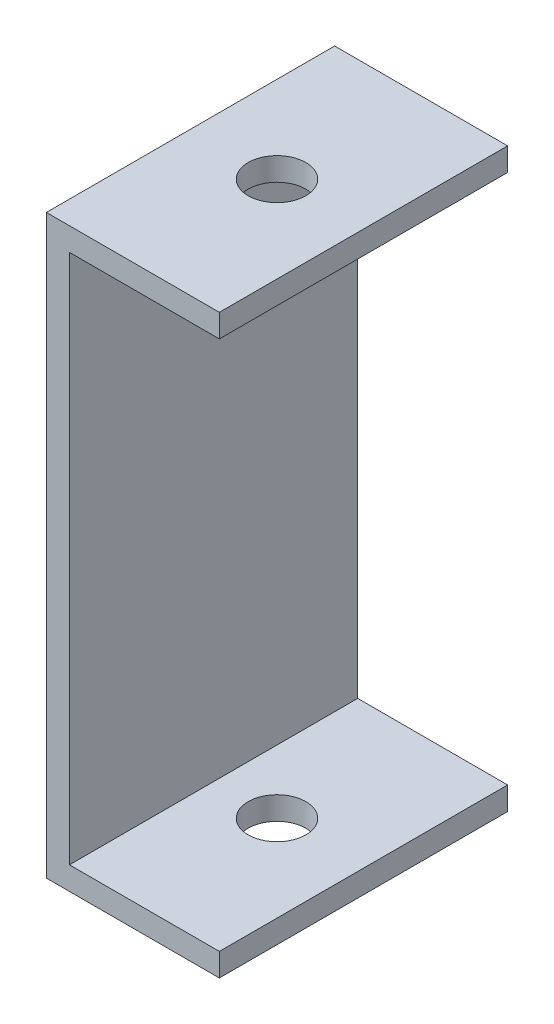
ISO-10303-21;
HEADER;
FILE_DESCRIPTION(('STEP AP214'),'2;1');
FILE_NAME('part.step','',(''),(''),'','','');
FILE_SCHEMA(('AUTOMOTIVE_DESIGN { 1 0 10303 214 1 1 1 1 }'));
ENDSEC;
DATA;
#1=APPLICATION_CONTEXT('core data for automotive mechanical design processes');
#2=APPLICATION_PROTOCOL_DEFINITION('international standard','automotive_design',2000,#1);
#3=PRODUCT_CONTEXT('',#1,'mechanical');
#4=PRODUCT('Part','Part','',(#3));
#5=PRODUCT_RELATED_PRODUCT_CATEGORY('part','',(#4));
#6=PRODUCT_DEFINITION_FORMATION('','',#4);
#7=PRODUCT_DEFINITION_CONTEXT('part definition',#1,'design');
#8=PRODUCT_DEFINITION('design','',#6,#7);
#9=PRODUCT_DEFINITION_SHAPE('','',#8);
#10=(LENGTH_UNIT() NAMED_UNIT(*) SI_UNIT(.MILLI.,.METRE.));
#11=(NAMED_UNIT(*) PLANE_ANGLE_UNIT() SI_UNIT($,.RADIAN.));
#12=(NAMED_UNIT(*) SI_UNIT($,.STERADIAN.) SOLID_ANGLE_UNIT());
#13=UNCERTAINTY_MEASURE_WITH_UNIT(LENGTH_MEASURE(1.E-05),#10,'distance_accuracy_value','');
#14=(GEOMETRIC_REPRESENTATION_CONTEXT(3) GLOBAL_UNCERTAINTY_ASSIGNED_CONTEXT((#13)) GLOBAL_UNIT_ASSIGNED_CONTEXT((#10,
#11,#12)) REPRESENTATION_CONTEXT('',''));
#15=CARTESIAN_POINT('',(0.,0.,0.));
#16=DIRECTION('',(0.,0.,1.));
#17=DIRECTION('',(1.,0.,0.));
#18=AXIS2_PLACEMENT_3D('',#15,#16,#17);
#19=CARTESIAN_POINT('',(15.,2.,25.));
#20=DIRECTION('',(-1.,0.,0.));
#21=DIRECTION('',(0.,0.,1.));
#22=AXIS2_PLACEMENT_3D('',#19,#20,#21);
#23=PLANE('',#22);
#24=DIRECTION('',(0.,1.,0.));
#25=VECTOR('',#24,1.);
#26=CARTESIAN_POINT('',(15.,2.,0.));
#27=LINE('',#26,#25);
#28=CARTESIAN_POINT('',(15.,0.,0.));
#29=VERTEX_POINT('',#28);
#30=CARTESIAN_POINT('',(15.,2.,0.));
#31=VERTEX_POINT('',#30);
#32=EDGE_CURVE('E144',#29,#31,#27,.T.);
#33=ORIENTED_EDGE('',*,*,#32,.T.);
#34=DIRECTION('',(0.,0.,-1.));
#35=VECTOR('',#34,1.);
#36=CARTESIAN_POINT('',(15.,2.,25.));
#37=LINE('',#36,#35);
#38=CARTESIAN_POINT('',(15.,2.,25.));
#39=VERTEX_POINT('',#38);
#40=EDGE_CURVE('E11',#39,#31,#37,.T.);
#41=ORIENTED_EDGE('',*,*,#40,.F.);
#42=DIRECTION('',(0.,1.,0.));
#43=VECTOR('',#42,1.);
#44=CARTESIAN_POINT('',(15.,2.,25.));
#45=LINE('',#44,#43);
#46=CARTESIAN_POINT('',(15.,0.,25.));
#47=VERTEX_POINT('',#46);
#48=EDGE_CURVE('E167',#47,#39,#45,.T.);
#49=ORIENTED_EDGE('',*,*,#48,.F.);
#50=DIRECTION('',(0.,0.,-1.));
#51=VECTOR('',#50,1.);
#52=CARTESIAN_POINT('',(15.,0.,25.));
#53=LINE('',#52,#51);
#54=EDGE_CURVE('E140',#47,#29,#53,.T.);
#55=ORIENTED_EDGE('',*,*,#54,.T.);
#56=EDGE_LOOP('',(#33,#41,#49,#55));
#57=FACE_BOUND('',#56,.T.);
#58=ADVANCED_FACE('F43',(#57),#23,.F.);
#59=CARTESIAN_POINT('',(2.00000000000001,2.,25.));
#60=DIRECTION('',(0.,-1.,0.));
#61=DIRECTION('',(1.,0.,0.));
#62=AXIS2_PLACEMENT_3D('',#59,#60,#61);
#63=PLANE('',#62);
#64=CARTESIAN_POINT('',(7.5,2.,12.5));
#65=DIRECTION('',(0.,-1.,0.));
#66=DIRECTION('',(1.,0.,0.));
#67=AXIS2_PLACEMENT_3D('',#64,#65,#66);
#68=CIRCLE('',#67,2.5);
#69=CARTESIAN_POINT('',(7.5,2.,15.));
#70=VERTEX_POINT('',#69);
#71=EDGE_CURVE('E149',#70,#70,#68,.T.);
#72=ORIENTED_EDGE('',*,*,#71,.T.);
#73=EDGE_LOOP('',(#72));
#74=FACE_BOUND('',#73,.T.);
#75=DIRECTION('',(-1.,0.,0.));
#76=VECTOR('',#75,1.);
#77=CARTESIAN_POINT('',(2.00000000000001,2.,0.));
#78=LINE('',#77,#76);
#79=CARTESIAN_POINT('',(2.00000000000001,2.,0.));
#80=VERTEX_POINT('',#79);
#81=EDGE_CURVE('E148',#31,#80,#78,.T.);
#82=ORIENTED_EDGE('',*,*,#81,.T.);
#83=DIRECTION('',(0.,0.,-1.));
#84=VECTOR('',#83,1.);
#85=CARTESIAN_POINT('',(2.00000000000001,2.,25.));
#86=LINE('',#85,#84);
#87=CARTESIAN_POINT('',(2.00000000000001,2.,25.));
#88=VERTEX_POINT('',#87);
#89=EDGE_CURVE('E52',#88,#80,#86,.T.);
#90=ORIENTED_EDGE('',*,*,#89,.F.);
#91=DIRECTION('',(-1.,0.,0.));
#92=VECTOR('',#91,1.);
#93=CARTESIAN_POINT('',(2.00000000000001,2.,25.));
#94=LINE('',#93,#92);
#95=EDGE_CURVE('E103',#39,#88,#94,.T.);
#96=ORIENTED_EDGE('',*,*,#95,.F.);
#97=ORIENTED_EDGE('',*,*,#40,.T.);
#98=EDGE_LOOP('',(#82,#90,#96,#97));
#99=FACE_BOUND('',#98,.T.);
#100=ADVANCED_FACE('F236',(#74,#99),#63,.F.);
#101=CARTESIAN_POINT('',(2.,48.,25.));
#102=DIRECTION('',(-1.,0.,0.));
#103=DIRECTION('',(0.,-1.,0.));
#104=AXIS2_PLACEMENT_3D('',#101,#102,#103);
#105=PLANE('',#104);
#106=DIRECTION('',(0.,1.,0.));
#107=VECTOR('',#106,1.);
#108=CARTESIAN_POINT('',(2.,48.,0.));
#109=LINE('',#108,#107);
#110=CARTESIAN_POINT('',(2.,48.,0.));
#111=VERTEX_POINT('',#110);
#112=EDGE_CURVE('E152',#80,#111,#109,.T.);
#113=ORIENTED_EDGE('',*,*,#112,.T.);
#114=DIRECTION('',(0.,0.,-1.));
#115=VECTOR('',#114,1.);
#116=CARTESIAN_POINT('',(2.,48.,25.));
#117=LINE('',#116,#115);
#118=CARTESIAN_POINT('',(2.,48.,25.));
#119=VERTEX_POINT('',#118);
#120=EDGE_CURVE('E178',#119,#111,#117,.T.);
#121=ORIENTED_EDGE('',*,*,#120,.F.);
#122=DIRECTION('',(0.,1.,0.));
#123=VECTOR('',#122,1.);
#124=CARTESIAN_POINT('',(2.,48.,25.));
#125=LINE('',#124,#123);
#126=EDGE_CURVE('E188',#88,#119,#125,.T.);
#127=ORIENTED_EDGE('',*,*,#126,.F.);
#128=ORIENTED_EDGE('',*,*,#89,.T.);
#129=EDGE_LOOP('',(#113,#121,#127,#128));
#130=FACE_BOUND('',#129,.T.);
#131=ADVANCED_FACE('F186',(#130),#105,.F.);
#132=CARTESIAN_POINT('',(15.,48.,25.));
#133=DIRECTION('',(0.,1.,0.));
#134=DIRECTION('',(0.,0.,1.));
#135=AXIS2_PLACEMENT_3D('',#132,#133,#134);
#136=PLANE('',#135);
#137=CARTESIAN_POINT('',(7.5,48.,12.5));
#138=DIRECTION('',(0.,1.,0.));
#139=DIRECTION('',(0.,0.,1.));
#140=AXIS2_PLACEMENT_3D('',#137,#138,#139);
#141=CIRCLE('',#140,2.5);
#142=CARTESIAN_POINT('',(7.5,48.,15.));
#143=VERTEX_POINT('',#142);
#144=EDGE_CURVE('E214',#143,#143,#141,.T.);
#145=ORIENTED_EDGE('',*,*,#144,.T.);
#146=EDGE_LOOP('',(#145));
#147=FACE_BOUND('',#146,.T.);
#148=DIRECTION('',(1.,0.,0.));
#149=VECTOR('',#148,1.);
#150=CARTESIAN_POINT('',(15.,48.,0.));
#151=LINE('',#150,#149);
#152=CARTESIAN_POINT('',(15.,48.,0.));
#153=VERTEX_POINT('',#152);
#154=EDGE_CURVE('E155',#111,#153,#151,.T.);
#155=ORIENTED_EDGE('',*,*,#154,.T.);
#156=DIRECTION('',(0.,0.,-1.));
#157=VECTOR('',#156,1.);
#158=CARTESIAN_POINT('',(15.,48.,25.));
#159=LINE('',#158,#157);
#160=CARTESIAN_POINT('',(15.,48.,25.));
#161=VERTEX_POINT('',#160);
#162=EDGE_CURVE('E174',#161,#153,#159,.T.);
#163=ORIENTED_EDGE('',*,*,#162,.F.);
#164=DIRECTION('',(1.,0.,0.));
#165=VECTOR('',#164,1.);
#166=CARTESIAN_POINT('',(15.,48.,25.));
#167=LINE('',#166,#165);
#168=EDGE_CURVE('E201',#119,#161,#167,.T.);
#169=ORIENTED_EDGE('',*,*,#168,.F.);
#170=ORIENTED_EDGE('',*,*,#120,.T.);
#171=EDGE_LOOP('',(#155,#163,#169,#170));
#172=FACE_BOUND('',#171,.T.);
#173=ADVANCED_FACE('F196',(#147,#172),#136,.F.);
#174=CARTESIAN_POINT('',(15.,50.,25.));
#175=DIRECTION('',(-1.,0.,0.));
#176=DIRECTION('',(0.,0.,1.));
#177=AXIS2_PLACEMENT_3D('',#174,#175,#176);
#178=PLANE('',#177);
#179=DIRECTION('',(0.,1.,0.));
#180=VECTOR('',#179,1.);
#181=CARTESIAN_POINT('',(15.,50.,0.));
#182=LINE('',#181,#180);
#183=CARTESIAN_POINT('',(15.,50.,0.));
#184=VERTEX_POINT('',#183);
#185=EDGE_CURVE('E158',#153,#184,#182,.T.);
#186=ORIENTED_EDGE('',*,*,#185,.T.);
#187=DIRECTION('',(0.,0.,-1.));
#188=VECTOR('',#187,1.);
#189=CARTESIAN_POINT('',(15.,50.,25.));
#190=LINE('',#189,#188);
#191=CARTESIAN_POINT('',(15.,50.,25.));
#192=VERTEX_POINT('',#191);
#193=EDGE_CURVE('E133',#192,#184,#190,.T.);
#194=ORIENTED_EDGE('',*,*,#193,.F.);
#195=DIRECTION('',(0.,1.,0.));
#196=VECTOR('',#195,1.);
#197=CARTESIAN_POINT('',(15.,50.,25.));
#198=LINE('',#197,#196);
#199=EDGE_CURVE('E122',#161,#192,#198,.T.);
#200=ORIENTED_EDGE('',*,*,#199,.F.);
#201=ORIENTED_EDGE('',*,*,#162,.T.);
#202=EDGE_LOOP('',(#186,#194,#200,#201));
#203=FACE_BOUND('',#202,.T.);
#204=ADVANCED_FACE('F199',(#203),#178,.F.);
#205=CARTESIAN_POINT('',(0.,50.,25.));
#206=DIRECTION('',(0.,-1.,0.));
#207=DIRECTION('',(0.,0.,-1.));
#208=AXIS2_PLACEMENT_3D('',#205,#206,#207);
#209=PLANE('',#208);
#210=CARTESIAN_POINT('',(7.5,50.,12.5));
#211=DIRECTION('',(0.,1.,0.));
#212=DIRECTION('',(0.,0.,1.));
#213=AXIS2_PLACEMENT_3D('',#210,#211,#212);
#214=CIRCLE('',#213,2.5);
#215=CARTESIAN_POINT('',(7.5,50.,15.));
#216=VERTEX_POINT('',#215);
#217=EDGE_CURVE('E219',#216,#216,#214,.T.);
#218=ORIENTED_EDGE('',*,*,#217,.F.);
#219=EDGE_LOOP('',(#218));
#220=FACE_BOUND('',#219,.T.);
#221=DIRECTION('',(-1.,0.,0.));
#222=VECTOR('',#221,1.);
#223=CARTESIAN_POINT('',(0.,50.,0.));
#224=LINE('',#223,#222);
#225=CARTESIAN_POINT('',(0.,50.,0.));
#226=VERTEX_POINT('',#225);
#227=EDGE_CURVE('E131',#184,#226,#224,.T.);
#228=ORIENTED_EDGE('',*,*,#227,.T.);
#229=DIRECTION('',(0.,0.,-1.));
#230=VECTOR('',#229,1.);
#231=CARTESIAN_POINT('',(0.,50.,25.));
#232=LINE('',#231,#230);
#233=CARTESIAN_POINT('',(0.,50.,25.));
#234=VERTEX_POINT('',#233);
#235=EDGE_CURVE('E128',#234,#226,#232,.T.);
#236=ORIENTED_EDGE('',*,*,#235,.F.);
#237=DIRECTION('',(-1.,0.,0.));
#238=VECTOR('',#237,1.);
#239=CARTESIAN_POINT('',(0.,50.,25.));
#240=LINE('',#239,#238);
#241=EDGE_CURVE('E116',#192,#234,#240,.T.);
#242=ORIENTED_EDGE('',*,*,#241,.F.);
#243=ORIENTED_EDGE('',*,*,#193,.T.);
#244=EDGE_LOOP('',(#228,#236,#242,#243));
#245=FACE_BOUND('',#244,.T.);
#246=ADVANCED_FACE('F129',(#220,#245),#209,.F.);
#247=CARTESIAN_POINT('',(0.,0.,25.));
#248=DIRECTION('',(1.,0.,0.));
#249=DIRECTION('',(0.,0.,-1.));
#250=AXIS2_PLACEMENT_3D('',#247,#248,#249);
#251=PLANE('',#250);
#252=DIRECTION('',(0.,-1.,0.));
#253=VECTOR('',#252,1.);
#254=CARTESIAN_POINT('',(0.,0.,0.));
#255=LINE('',#254,#253);
#256=CARTESIAN_POINT('',(0.,0.,0.));
#257=VERTEX_POINT('',#256);
#258=EDGE_CURVE('E89',#226,#257,#255,.T.);
#259=ORIENTED_EDGE('',*,*,#258,.T.);
#260=DIRECTION('',(0.,0.,-1.));
#261=VECTOR('',#260,1.);
#262=CARTESIAN_POINT('',(0.,0.,25.));
#263=LINE('',#262,#261);
#264=CARTESIAN_POINT('',(0.,0.,25.));
#265=VERTEX_POINT('',#264);
#266=EDGE_CURVE('E134',#265,#257,#263,.T.);
#267=ORIENTED_EDGE('',*,*,#266,.F.);
#268=DIRECTION('',(0.,-1.,0.));
#269=VECTOR('',#268,1.);
#270=CARTESIAN_POINT('',(0.,0.,25.));
#271=LINE('',#270,#269);
#272=EDGE_CURVE('E120',#234,#265,#271,.T.);
#273=ORIENTED_EDGE('',*,*,#272,.F.);
#274=ORIENTED_EDGE('',*,*,#235,.T.);
#275=EDGE_LOOP('',(#259,#267,#273,#274));
#276=FACE_BOUND('',#275,.T.);
#277=ADVANCED_FACE('F136',(#276),#251,.F.);
#278=CARTESIAN_POINT('',(15.,0.,25.));
#279=DIRECTION('',(0.,1.,0.));
#280=DIRECTION('',(-1.,0.,0.));
#281=AXIS2_PLACEMENT_3D('',#278,#279,#280);
#282=PLANE('',#281);
#283=CARTESIAN_POINT('',(7.5,0.,12.5));
#284=DIRECTION('',(0.,1.,0.));
#285=DIRECTION('',(0.,0.,1.));
#286=AXIS2_PLACEMENT_3D('',#283,#284,#285);
#287=CIRCLE('',#286,2.5);
#288=CARTESIAN_POINT('',(7.5,0.,15.));
#289=VERTEX_POINT('',#288);
#290=EDGE_CURVE('E218',#289,#289,#287,.T.);
#291=ORIENTED_EDGE('',*,*,#290,.T.);
#292=EDGE_LOOP('',(#291));
#293=FACE_BOUND('',#292,.T.);
#294=DIRECTION('',(1.,0.,0.));
#295=VECTOR('',#294,1.);
#296=CARTESIAN_POINT('',(15.,0.,0.));
#297=LINE('',#296,#295);
#298=EDGE_CURVE('E95',#257,#29,#297,.T.);
#299=ORIENTED_EDGE('',*,*,#298,.T.);
#300=ORIENTED_EDGE('',*,*,#54,.F.);
#301=DIRECTION('',(1.,0.,0.));
#302=VECTOR('',#301,1.);
#303=CARTESIAN_POINT('',(15.,0.,25.));
#304=LINE('',#303,#302);
#305=EDGE_CURVE('E60',#265,#47,#304,.T.);
#306=ORIENTED_EDGE('',*,*,#305,.F.);
#307=ORIENTED_EDGE('',*,*,#266,.T.);
#308=EDGE_LOOP('',(#299,#300,#306,#307));
#309=FACE_BOUND('',#308,.T.);
#310=ADVANCED_FACE('F227',(#293,#309),#282,.F.);
#311=CARTESIAN_POINT('',(0.,0.,25.));
#312=DIRECTION('',(0.,0.,-1.));
#313=DIRECTION('',(-1.,0.,0.));
#314=AXIS2_PLACEMENT_3D('',#311,#312,#313);
#315=PLANE('',#314);
#316=ORIENTED_EDGE('',*,*,#48,.T.);
#317=ORIENTED_EDGE('',*,*,#95,.T.);
#318=ORIENTED_EDGE('',*,*,#126,.T.);
#319=ORIENTED_EDGE('',*,*,#168,.T.);
#320=ORIENTED_EDGE('',*,*,#199,.T.);
#321=ORIENTED_EDGE('',*,*,#241,.T.);
#322=ORIENTED_EDGE('',*,*,#272,.T.);
#323=ORIENTED_EDGE('',*,*,#305,.T.);
#324=EDGE_LOOP('',(#316,#317,#318,#319,#320,#321,#322,#323));
#325=FACE_BOUND('',#324,.T.);
#326=ADVANCED_FACE('F118',(#325),#315,.F.);
#327=CARTESIAN_POINT('',(0.,0.,0.));
#328=DIRECTION('',(0.,0.,-1.));
#329=DIRECTION('',(-1.,0.,0.));
#330=AXIS2_PLACEMENT_3D('',#327,#328,#329);
#331=PLANE('',#330);
#332=ORIENTED_EDGE('',*,*,#32,.F.);
#333=ORIENTED_EDGE('',*,*,#298,.F.);
#334=ORIENTED_EDGE('',*,*,#258,.F.);
#335=ORIENTED_EDGE('',*,*,#227,.F.);
#336=ORIENTED_EDGE('',*,*,#185,.F.);
#337=ORIENTED_EDGE('',*,*,#154,.F.);
#338=ORIENTED_EDGE('',*,*,#112,.F.);
#339=ORIENTED_EDGE('',*,*,#81,.F.);
#340=EDGE_LOOP('',(#332,#333,#334,#335,#336,#337,#338,#339));
#341=FACE_BOUND('',#340,.T.);
#342=ADVANCED_FACE('F192',(#341),#331,.T.);
#343=CARTESIAN_POINT('',(7.5,0.,12.5));
#344=DIRECTION('',(0.,1.,0.));
#345=DIRECTION('',(0.,0.,1.));
#346=AXIS2_PLACEMENT_3D('',#343,#344,#345);
#347=CYLINDRICAL_SURFACE('',#346,2.5);
#348=CARTESIAN_POINT('',(7.5,0.,15.));
#349=CARTESIAN_POINT('',(7.5,0.0208333333333334,15.));
#350=CARTESIAN_POINT('',(7.5,0.0416666666666667,15.));
#351=CARTESIAN_POINT('',(7.5,0.0833333333333334,15.));
#352=CARTESIAN_POINT('',(7.5,0.104166666666667,15.));
#353=CARTESIAN_POINT('',(7.5,0.145833333333333,15.));
#354=CARTESIAN_POINT('',(7.5,0.166666666666667,15.));
#355=CARTESIAN_POINT('',(7.5,0.208333333333333,15.));
#356=CARTESIAN_POINT('',(7.5,0.229166666666667,15.));
#357=CARTESIAN_POINT('',(7.5,0.270833333333334,15.));
#358=CARTESIAN_POINT('',(7.5,0.291666666666667,15.));
#359=CARTESIAN_POINT('',(7.5,0.333333333333334,15.));
#360=CARTESIAN_POINT('',(7.5,0.354166666666667,15.));
#361=CARTESIAN_POINT('',(7.5,0.395833333333334,15.));
#362=CARTESIAN_POINT('',(7.5,0.416666666666667,15.));
#363=CARTESIAN_POINT('',(7.5,0.458333333333334,15.));
#364=CARTESIAN_POINT('',(7.5,0.479166666666667,15.));
#365=CARTESIAN_POINT('',(7.5,0.520833333333334,15.));
#366=CARTESIAN_POINT('',(7.5,0.541666666666667,15.));
#367=CARTESIAN_POINT('',(7.5,0.583333333333334,15.));
#368=CARTESIAN_POINT('',(7.5,0.604166666666667,15.));
#369=CARTESIAN_POINT('',(7.5,0.645833333333334,15.));
#370=CARTESIAN_POINT('',(7.5,0.666666666666667,15.));
#371=CARTESIAN_POINT('',(7.5,0.708333333333334,15.));
#372=CARTESIAN_POINT('',(7.5,0.729166666666667,15.));
#373=CARTESIAN_POINT('',(7.5,0.770833333333334,15.));
#374=CARTESIAN_POINT('',(7.5,0.791666666666667,15.));
#375=CARTESIAN_POINT('',(7.5,0.833333333333334,15.));
#376=CARTESIAN_POINT('',(7.5,0.854166666666667,15.));
#377=CARTESIAN_POINT('',(7.5,0.895833333333334,15.));
#378=CARTESIAN_POINT('',(7.5,0.916666666666667,15.));
#379=CARTESIAN_POINT('',(7.5,0.958333333333334,15.));
#380=CARTESIAN_POINT('',(7.5,0.979166666666667,15.));
#381=CARTESIAN_POINT('',(7.5,1.02083333333333,15.));
#382=CARTESIAN_POINT('',(7.5,1.04166666666667,15.));
#383=CARTESIAN_POINT('',(7.5,1.08333333333333,15.));
#384=CARTESIAN_POINT('',(7.5,1.10416666666667,15.));
#385=CARTESIAN_POINT('',(7.5,1.14583333333333,15.));
#386=CARTESIAN_POINT('',(7.5,1.16666666666667,15.));
#387=CARTESIAN_POINT('',(7.5,1.20833333333333,15.));
#388=CARTESIAN_POINT('',(7.5,1.22916666666667,15.));
#389=CARTESIAN_POINT('',(7.5,1.27083333333333,15.));
#390=CARTESIAN_POINT('',(7.5,1.29166666666667,15.));
#391=CARTESIAN_POINT('',(7.5,1.33333333333333,15.));
#392=CARTESIAN_POINT('',(7.5,1.35416666666667,15.));
#393=CARTESIAN_POINT('',(7.5,1.39583333333333,15.));
#394=CARTESIAN_POINT('',(7.5,1.41666666666667,15.));
#395=CARTESIAN_POINT('',(7.5,1.45833333333333,15.));
#396=CARTESIAN_POINT('',(7.5,1.47916666666667,15.));
#397=CARTESIAN_POINT('',(7.5,1.52083333333333,15.));
#398=CARTESIAN_POINT('',(7.5,1.54166666666667,15.));
#399=CARTESIAN_POINT('',(7.5,1.58333333333333,15.));
#400=CARTESIAN_POINT('',(7.5,1.60416666666667,15.));
#401=CARTESIAN_POINT('',(7.5,1.64583333333333,15.));
#402=CARTESIAN_POINT('',(7.5,1.66666666666667,15.));
#403=CARTESIAN_POINT('',(7.5,1.70833333333333,15.));
#404=CARTESIAN_POINT('',(7.5,1.72916666666667,15.));
#405=CARTESIAN_POINT('',(7.5,1.77083333333333,15.));
#406=CARTESIAN_POINT('',(7.5,1.79166666666667,15.));
#407=CARTESIAN_POINT('',(7.5,1.83333333333333,15.));
#408=CARTESIAN_POINT('',(7.5,1.85416666666667,15.));
#409=CARTESIAN_POINT('',(7.5,1.89583333333333,15.));
#410=CARTESIAN_POINT('',(7.5,1.91666666666667,15.));
#411=CARTESIAN_POINT('',(7.5,1.95833333333334,15.));
#412=CARTESIAN_POINT('',(7.5,1.97916666666667,15.));
#413=CARTESIAN_POINT('',(7.5,2.,15.));
#414=B_SPLINE_CURVE_WITH_KNOTS('',3,(#348,#349,#350,#351,#352,#353,#354,#355,#356,#357,#358,
#359,#360,#361,#362,#363,#364,#365,#366,#367,#368,#369,#370,#371,#372,#373,#374,#375,#376,#377,
#378,#379,#380,#381,#382,#383,#384,#385,#386,#387,#388,#389,#390,#391,#392,#393,#394,#395,#396,
#397,#398,#399,#400,#401,#402,#403,#404,#405,#406,#407,#408,#409,#410,#411,#412,#413),
.UNSPECIFIED.,.F.,.F.,(4,2,2,2,2,2,2,2,2,2,2,2,2,2,2,2,2,2,2,2,2,2,2,2,2,2,2,2,2,2,2,2,4),(0.,
0.0625,0.125,0.1875,0.25,0.3125,0.375,0.4375,0.5,0.5625,0.625,0.687500000000001,
0.750000000000001,0.812500000000001,0.875000000000001,0.937500000000001,1.,1.0625,1.125,1.1875,
1.25,1.3125,1.375,1.4375,1.5,1.5625,1.625,1.6875,1.75,1.8125,1.875,1.9375,2.),.UNSPECIFIED.);
#415=EDGE_CURVE('BSEAM229',#289,#70,#414,.T.);
#416=ORIENTED_EDGE('',*,*,#290,.F.);
#417=ORIENTED_EDGE('',*,*,#71,.F.);
#418=ORIENTED_EDGE('',*,*,#415,.T.);
#419=ORIENTED_EDGE('',*,*,#415,.F.);
#420=EDGE_LOOP('',(#416,#418,#417,#419));
#421=FACE_BOUND('',#420,.T.);
#422=ADVANCED_FACE('F229',(#421),#347,.F.);
#423=CARTESIAN_POINT('',(7.5,50.,15.));
#424=CARTESIAN_POINT('',(7.5,49.9791666666667,15.));
#425=CARTESIAN_POINT('',(7.5,49.9583333333333,15.));
#426=CARTESIAN_POINT('',(7.5,49.9166666666667,15.));
#427=CARTESIAN_POINT('',(7.5,49.8958333333333,15.));
#428=CARTESIAN_POINT('',(7.5,49.8541666666667,15.));
#429=CARTESIAN_POINT('',(7.5,49.8333333333333,15.));
#430=CARTESIAN_POINT('',(7.5,49.7916666666667,15.));
#431=CARTESIAN_POINT('',(7.5,49.7708333333333,15.));
#432=CARTESIAN_POINT('',(7.5,49.7291666666667,15.));
#433=CARTESIAN_POINT('',(7.5,49.7083333333333,15.));
#434=CARTESIAN_POINT('',(7.5,49.6666666666667,15.));
#435=CARTESIAN_POINT('',(7.5,49.6458333333333,15.));
#436=CARTESIAN_POINT('',(7.5,49.6041666666667,15.));
#437=CARTESIAN_POINT('',(7.5,49.5833333333333,15.));
#438=CARTESIAN_POINT('',(7.5,49.5416666666667,15.));
#439=CARTESIAN_POINT('',(7.5,49.5208333333333,15.));
#440=CARTESIAN_POINT('',(7.5,49.4791666666667,15.));
#441=CARTESIAN_POINT('',(7.5,49.4583333333333,15.));
#442=CARTESIAN_POINT('',(7.5,49.4166666666667,15.));
#443=CARTESIAN_POINT('',(7.5,49.3958333333333,15.));
#444=CARTESIAN_POINT('',(7.5,49.3541666666667,15.));
#445=CARTESIAN_POINT('',(7.5,49.3333333333333,15.));
#446=CARTESIAN_POINT('',(7.5,49.2916666666667,15.));
#447=CARTESIAN_POINT('',(7.5,49.2708333333333,15.));
#448=CARTESIAN_POINT('',(7.5,49.2291666666667,15.));
#449=CARTESIAN_POINT('',(7.5,49.2083333333333,15.));
#450=CARTESIAN_POINT('',(7.5,49.1666666666667,15.));
#451=CARTESIAN_POINT('',(7.5,49.1458333333333,15.));
#452=CARTESIAN_POINT('',(7.5,49.1041666666667,15.));
#453=CARTESIAN_POINT('',(7.5,49.0833333333333,15.));
#454=CARTESIAN_POINT('',(7.5,49.0416666666667,15.));
#455=CARTESIAN_POINT('',(7.5,49.0208333333333,15.));
#456=CARTESIAN_POINT('',(7.5,48.9791666666667,15.));
#457=CARTESIAN_POINT('',(7.5,48.9583333333333,15.));
#458=CARTESIAN_POINT('',(7.5,48.9166666666667,15.));
#459=CARTESIAN_POINT('',(7.5,48.8958333333333,15.));
#460=CARTESIAN_POINT('',(7.5,48.8541666666667,15.));
#461=CARTESIAN_POINT('',(7.5,48.8333333333333,15.));
#462=CARTESIAN_POINT('',(7.5,48.7916666666667,15.));
#463=CARTESIAN_POINT('',(7.5,48.7708333333333,15.));
#464=CARTESIAN_POINT('',(7.5,48.7291666666667,15.));
#465=CARTESIAN_POINT('',(7.5,48.7083333333333,15.));
#466=CARTESIAN_POINT('',(7.5,48.6666666666667,15.));
#467=CARTESIAN_POINT('',(7.5,48.6458333333333,15.));
#468=CARTESIAN_POINT('',(7.5,48.6041666666667,15.));
#469=CARTESIAN_POINT('',(7.5,48.5833333333333,15.));
#470=CARTESIAN_POINT('',(7.5,48.5416666666667,15.));
#471=CARTESIAN_POINT('',(7.5,48.5208333333333,15.));
#472=CARTESIAN_POINT('',(7.5,48.4791666666667,15.));
#473=CARTESIAN_POINT('',(7.5,48.4583333333333,15.));
#474=CARTESIAN_POINT('',(7.5,48.4166666666667,15.));
#475=CARTESIAN_POINT('',(7.5,48.3958333333333,15.));
#476=CARTESIAN_POINT('',(7.5,48.3541666666667,15.));
#477=CARTESIAN_POINT('',(7.5,48.3333333333333,15.));
#478=CARTESIAN_POINT('',(7.5,48.2916666666667,15.));
#479=CARTESIAN_POINT('',(7.5,48.2708333333333,15.));
#480=CARTESIAN_POINT('',(7.5,48.2291666666667,15.));
#481=CARTESIAN_POINT('',(7.5,48.2083333333333,15.));
#482=CARTESIAN_POINT('',(7.5,48.1666666666667,15.));
#483=CARTESIAN_POINT('',(7.5,48.1458333333333,15.));
#484=CARTESIAN_POINT('',(7.5,48.1041666666667,15.));
#485=CARTESIAN_POINT('',(7.5,48.0833333333333,15.));
#486=CARTESIAN_POINT('',(7.5,48.0416666666667,15.));
#487=CARTESIAN_POINT('',(7.5,48.0208333333333,15.));
#488=CARTESIAN_POINT('',(7.5,48.,15.));
#489=B_SPLINE_CURVE_WITH_KNOTS('',3,(#423,#424,#425,#426,#427,#428,#429,#430,#431,#432,#433,
#434,#435,#436,#437,#438,#439,#440,#441,#442,#443,#444,#445,#446,#447,#448,#449,#450,#451,#452,
#453,#454,#455,#456,#457,#458,#459,#460,#461,#462,#463,#464,#465,#466,#467,#468,#469,#470,#471,
#472,#473,#474,#475,#476,#477,#478,#479,#480,#481,#482,#483,#484,#485,#486,#487,#488),
.UNSPECIFIED.,.F.,.F.,(4,2,2,2,2,2,2,2,2,2,2,2,2,2,2,2,2,2,2,2,2,2,2,2,2,2,2,2,2,2,2,2,4),(0.,
0.0625000000000001,0.125,0.1875,0.25,0.3125,0.375,0.4375,0.5,0.5625,0.625000000000001,
0.687500000000001,0.750000000000001,0.812500000000001,0.875000000000001,0.937500000000001,1.,
1.0625,1.125,1.1875,1.25,1.3125,1.375,1.4375,1.5,1.5625,1.625,1.6875,1.75,1.8125,1.875,1.9375,
2.),.UNSPECIFIED.);
#490=EDGE_CURVE('BSEAM232',#216,#143,#489,.T.);
#491=ORIENTED_EDGE('',*,*,#217,.T.);
#492=ORIENTED_EDGE('',*,*,#144,.F.);
#493=ORIENTED_EDGE('',*,*,#490,.T.);
#494=ORIENTED_EDGE('',*,*,#490,.F.);
#495=EDGE_LOOP('',(#491,#493,#492,#494));
#496=FACE_BOUND('',#495,.T.);
#497=ADVANCED_FACE('F232',(#496),#347,.F.);
#498=CLOSED_SHELL('',(#58,#100,#131,#173,#204,#246,#277,#310,#326,#342,#422,#497));
#499=MANIFOLD_SOLID_BREP('B2',#498);
#500=ADVANCED_BREP_SHAPE_REPRESENTATION('',(#18,#499),#14);
#501=SHAPE_DEFINITION_REPRESENTATION(#9,#500);
ENDSEC;
END-ISO-10303-21;
